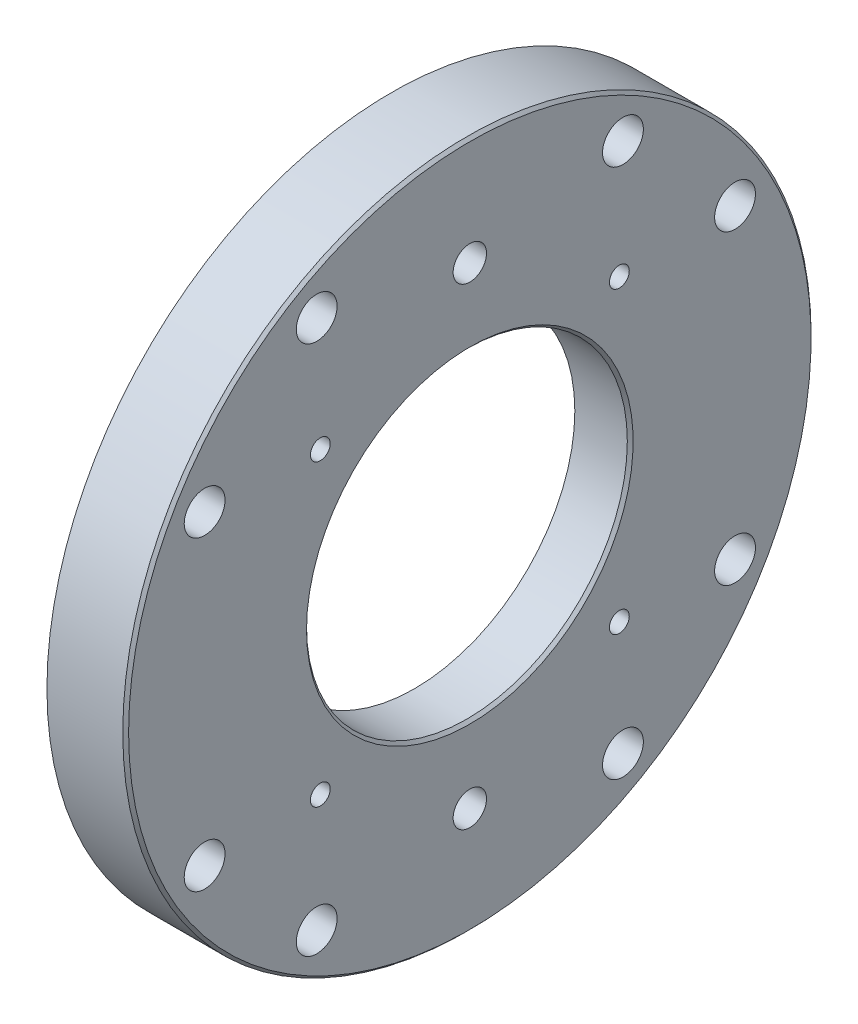
ISO-10303-21;
HEADER;
FILE_DESCRIPTION(('STEP AP214'),'2;1');
FILE_NAME('part.step','',(''),(''),'','','');
FILE_SCHEMA(('AUTOMOTIVE_DESIGN { 1 0 10303 214 1 1 1 1 }'));
ENDSEC;
DATA;
#1=APPLICATION_CONTEXT('core data for automotive mechanical design processes');
#2=APPLICATION_PROTOCOL_DEFINITION('international standard','automotive_design',2000,#1);
#3=PRODUCT_CONTEXT('',#1,'mechanical');
#4=PRODUCT('Part','Part','',(#3));
#5=PRODUCT_RELATED_PRODUCT_CATEGORY('part','',(#4));
#6=PRODUCT_DEFINITION_FORMATION('','',#4);
#7=PRODUCT_DEFINITION_CONTEXT('part definition',#1,'design');
#8=PRODUCT_DEFINITION('design','',#6,#7);
#9=PRODUCT_DEFINITION_SHAPE('','',#8);
#10=(LENGTH_UNIT() NAMED_UNIT(*) SI_UNIT(.MILLI.,.METRE.));
#11=(NAMED_UNIT(*) PLANE_ANGLE_UNIT() SI_UNIT($,.RADIAN.));
#12=(NAMED_UNIT(*) SI_UNIT($,.STERADIAN.) SOLID_ANGLE_UNIT());
#13=UNCERTAINTY_MEASURE_WITH_UNIT(LENGTH_MEASURE(1.E-05),#10,'distance_accuracy_value','');
#14=(GEOMETRIC_REPRESENTATION_CONTEXT(3) GLOBAL_UNCERTAINTY_ASSIGNED_CONTEXT((#13)) GLOBAL_UNIT_ASSIGNED_CONTEXT((#10,
#11,#12)) REPRESENTATION_CONTEXT('',''));
#15=CARTESIAN_POINT('',(0.,0.,0.));
#16=DIRECTION('',(0.,0.,1.));
#17=DIRECTION('',(1.,0.,0.));
#18=AXIS2_PLACEMENT_3D('',#15,#16,#17);
#19=CARTESIAN_POINT('',(0.,0.,0.));
#20=DIRECTION('',(-1.,0.,0.));
#21=DIRECTION('',(0.,0.,1.));
#22=AXIS2_PLACEMENT_3D('',#19,#20,#21);
#23=CONICAL_SURFACE('',#22,117.,0.785398163397442);
#24=CARTESIAN_POINT('',(-1.,0.,0.));
#25=DIRECTION('',(-1.,0.,0.));
#26=DIRECTION('',(0.,0.,1.));
#27=AXIS2_PLACEMENT_3D('',#24,#25,#26);
#28=CIRCLE('',#27,118.);
#29=CARTESIAN_POINT('',(-1.,0.,118.));
#30=VERTEX_POINT('',#29);
#31=EDGE_CURVE('E138',#30,#30,#28,.T.);
#32=ORIENTED_EDGE('',*,*,#31,.F.);
#33=EDGE_LOOP('',(#32));
#34=FACE_BOUND('',#33,.T.);
#35=CARTESIAN_POINT('',(0.,0.,0.));
#36=DIRECTION('',(-1.,0.,0.));
#37=DIRECTION('',(0.,0.,1.));
#38=AXIS2_PLACEMENT_3D('',#35,#36,#37);
#39=CIRCLE('',#38,117.);
#40=CARTESIAN_POINT('',(0.,0.,117.));
#41=VERTEX_POINT('',#40);
#42=EDGE_CURVE('E10',#41,#41,#39,.T.);
#43=ORIENTED_EDGE('',*,*,#42,.T.);
#44=EDGE_LOOP('',(#43));
#45=FACE_BOUND('',#44,.T.);
#46=ADVANCED_FACE('F37',(#34,#45),#23,.T.);
#47=CARTESIAN_POINT('',(0.,117.,0.));
#48=DIRECTION('',(-1.,0.,0.));
#49=DIRECTION('',(0.,0.,1.));
#50=AXIS2_PLACEMENT_3D('',#47,#48,#49);
#51=PLANE('',#50);
#52=CARTESIAN_POINT('',(0.,81.,0.));
#53=DIRECTION('',(-1.,0.,0.));
#54=DIRECTION('',(0.,0.,1.));
#55=AXIS2_PLACEMENT_3D('',#52,#53,#54);
#56=CIRCLE('',#55,5.7225);
#57=CARTESIAN_POINT('',(0.,81.,5.72249999999999));
#58=VERTEX_POINT('',#57);
#59=EDGE_CURVE('E90',#58,#58,#56,.T.);
#60=ORIENTED_EDGE('',*,*,#59,.T.);
#61=EDGE_LOOP('',(#60));
#62=FACE_BOUND('',#61,.T.);
#63=CARTESIAN_POINT('',(0.,-81.,0.));
#64=DIRECTION('',(-1.,0.,0.));
#65=DIRECTION('',(0.,0.,1.));
#66=AXIS2_PLACEMENT_3D('',#63,#64,#65);
#67=CIRCLE('',#66,5.7225);
#68=CARTESIAN_POINT('',(0.,-81.,5.72250000000002));
#69=VERTEX_POINT('',#68);
#70=EDGE_CURVE('E103',#69,#69,#67,.T.);
#71=ORIENTED_EDGE('',*,*,#70,.T.);
#72=EDGE_LOOP('',(#71));
#73=FACE_BOUND('',#72,.T.);
#74=CARTESIAN_POINT('',(0.,-51.2652416360247,-51.2652416360247));
#75=DIRECTION('',(-1.,0.,0.));
#76=DIRECTION('',(0.,0.,1.));
#77=AXIS2_PLACEMENT_3D('',#74,#75,#76);
#78=CIRCLE('',#77,3.4);
#79=CARTESIAN_POINT('',(0.,-51.2652416360247,-47.8652416360247));
#80=VERTEX_POINT('',#79);
#81=EDGE_CURVE('E57',#80,#80,#78,.T.);
#82=ORIENTED_EDGE('',*,*,#81,.T.);
#83=EDGE_LOOP('',(#82));
#84=FACE_BOUND('',#83,.T.);
#85=CARTESIAN_POINT('',(0.,-51.2652416360247,51.2652416360247));
#86=DIRECTION('',(-1.,0.,0.));
#87=DIRECTION('',(0.,0.,1.));
#88=AXIS2_PLACEMENT_3D('',#85,#86,#87);
#89=CIRCLE('',#88,3.4);
#90=CARTESIAN_POINT('',(0.,-51.2652416360247,54.6652416360247));
#91=VERTEX_POINT('',#90);
#92=EDGE_CURVE('E98',#91,#91,#89,.T.);
#93=ORIENTED_EDGE('',*,*,#92,.T.);
#94=EDGE_LOOP('',(#93));
#95=FACE_BOUND('',#94,.T.);
#96=CARTESIAN_POINT('',(0.,51.2652416360247,51.2652416360247));
#97=DIRECTION('',(-1.,0.,0.));
#98=DIRECTION('',(0.,0.,1.));
#99=AXIS2_PLACEMENT_3D('',#96,#97,#98);
#100=CIRCLE('',#99,3.4);
#101=CARTESIAN_POINT('',(0.,51.2652416360247,54.6652416360247));
#102=VERTEX_POINT('',#101);
#103=EDGE_CURVE('E94',#102,#102,#100,.T.);
#104=ORIENTED_EDGE('',*,*,#103,.T.);
#105=EDGE_LOOP('',(#104));
#106=FACE_BOUND('',#105,.T.);
#107=CARTESIAN_POINT('',(0.,51.2652416360247,-51.2652416360247));
#108=DIRECTION('',(-1.,0.,0.));
#109=DIRECTION('',(0.,0.,1.));
#110=AXIS2_PLACEMENT_3D('',#107,#108,#109);
#111=CIRCLE('',#110,3.4);
#112=CARTESIAN_POINT('',(0.,51.2652416360247,-47.8652416360247));
#113=VERTEX_POINT('',#112);
#114=EDGE_CURVE('E89',#113,#113,#111,.T.);
#115=ORIENTED_EDGE('',*,*,#114,.T.);
#116=EDGE_LOOP('',(#115));
#117=FACE_BOUND('',#116,.T.);
#118=CARTESIAN_POINT('',(0.,90.932667397366,-52.5));
#119=DIRECTION('',(-1.,0.,0.));
#120=DIRECTION('',(0.,0.,1.));
#121=AXIS2_PLACEMENT_3D('',#118,#119,#120);
#122=CIRCLE('',#121,7.);
#123=CARTESIAN_POINT('',(0.,90.932667397366,-45.5));
#124=VERTEX_POINT('',#123);
#125=EDGE_CURVE('E85',#124,#124,#122,.T.);
#126=ORIENTED_EDGE('',*,*,#125,.T.);
#127=EDGE_LOOP('',(#126));
#128=FACE_BOUND('',#127,.T.);
#129=CARTESIAN_POINT('',(0.,90.9326673973661,52.5));
#130=DIRECTION('',(-1.,0.,0.));
#131=DIRECTION('',(0.,0.,1.));
#132=AXIS2_PLACEMENT_3D('',#129,#130,#131);
#133=CIRCLE('',#132,7.);
#134=CARTESIAN_POINT('',(0.,90.9326673973661,59.5));
#135=VERTEX_POINT('',#134);
#136=EDGE_CURVE('E81',#135,#135,#133,.T.);
#137=ORIENTED_EDGE('',*,*,#136,.T.);
#138=EDGE_LOOP('',(#137));
#139=FACE_BOUND('',#138,.T.);
#140=CARTESIAN_POINT('',(0.,52.5,90.9326673973661));
#141=DIRECTION('',(-1.,0.,0.));
#142=DIRECTION('',(0.,0.,1.));
#143=AXIS2_PLACEMENT_3D('',#140,#141,#142);
#144=CIRCLE('',#143,7.00000000000001);
#145=CARTESIAN_POINT('',(0.,52.5,97.9326673973661));
#146=VERTEX_POINT('',#145);
#147=EDGE_CURVE('E77',#146,#146,#144,.T.);
#148=ORIENTED_EDGE('',*,*,#147,.T.);
#149=EDGE_LOOP('',(#148));
#150=FACE_BOUND('',#149,.T.);
#151=CARTESIAN_POINT('',(0.,-52.5,90.932667397366));
#152=DIRECTION('',(-1.,0.,0.));
#153=DIRECTION('',(0.,0.,1.));
#154=AXIS2_PLACEMENT_3D('',#151,#152,#153);
#155=CIRCLE('',#154,7.00000000000001);
#156=CARTESIAN_POINT('',(0.,-52.5,97.9326673973661));
#157=VERTEX_POINT('',#156);
#158=EDGE_CURVE('E73',#157,#157,#155,.T.);
#159=ORIENTED_EDGE('',*,*,#158,.T.);
#160=EDGE_LOOP('',(#159));
#161=FACE_BOUND('',#160,.T.);
#162=CARTESIAN_POINT('',(0.,-90.932667397366,52.5));
#163=DIRECTION('',(-1.,0.,0.));
#164=DIRECTION('',(0.,0.,1.));
#165=AXIS2_PLACEMENT_3D('',#162,#163,#164);
#166=CIRCLE('',#165,7.);
#167=CARTESIAN_POINT('',(0.,-90.932667397366,59.5));
#168=VERTEX_POINT('',#167);
#169=EDGE_CURVE('E69',#168,#168,#166,.T.);
#170=ORIENTED_EDGE('',*,*,#169,.T.);
#171=EDGE_LOOP('',(#170));
#172=FACE_BOUND('',#171,.T.);
#173=CARTESIAN_POINT('',(0.,-90.932667397366,-52.5));
#174=DIRECTION('',(-1.,0.,0.));
#175=DIRECTION('',(0.,0.,1.));
#176=AXIS2_PLACEMENT_3D('',#173,#174,#175);
#177=CIRCLE('',#176,7.);
#178=CARTESIAN_POINT('',(0.,-90.932667397366,-45.5));
#179=VERTEX_POINT('',#178);
#180=EDGE_CURVE('E65',#179,#179,#177,.T.);
#181=ORIENTED_EDGE('',*,*,#180,.T.);
#182=EDGE_LOOP('',(#181));
#183=FACE_BOUND('',#182,.T.);
#184=CARTESIAN_POINT('',(0.,-52.5,-90.932667397366));
#185=DIRECTION('',(-1.,0.,0.));
#186=DIRECTION('',(0.,0.,1.));
#187=AXIS2_PLACEMENT_3D('',#184,#185,#186);
#188=CIRCLE('',#187,7.00000000000001);
#189=CARTESIAN_POINT('',(0.,-52.5,-83.932667397366));
#190=VERTEX_POINT('',#189);
#191=EDGE_CURVE('E61',#190,#190,#188,.T.);
#192=ORIENTED_EDGE('',*,*,#191,.T.);
#193=EDGE_LOOP('',(#192));
#194=FACE_BOUND('',#193,.T.);
#195=CARTESIAN_POINT('',(0.,52.5,-90.9326673973661));
#196=DIRECTION('',(-1.,0.,0.));
#197=DIRECTION('',(0.,0.,1.));
#198=AXIS2_PLACEMENT_3D('',#195,#196,#197);
#199=CIRCLE('',#198,7.00000000000001);
#200=CARTESIAN_POINT('',(0.,52.5,-83.9326673973661));
#201=VERTEX_POINT('',#200);
#202=EDGE_CURVE('E56',#201,#201,#199,.T.);
#203=ORIENTED_EDGE('',*,*,#202,.T.);
#204=EDGE_LOOP('',(#203));
#205=FACE_BOUND('',#204,.T.);
#206=ORIENTED_EDGE('',*,*,#42,.F.);
#207=EDGE_LOOP('',(#206));
#208=FACE_BOUND('',#207,.T.);
#209=CARTESIAN_POINT('',(0.,0.,0.));
#210=DIRECTION('',(-1.,0.,0.));
#211=DIRECTION('',(0.,0.,1.));
#212=AXIS2_PLACEMENT_3D('',#209,#210,#211);
#213=CIRCLE('',#212,56.);
#214=CARTESIAN_POINT('',(0.,0.,56.));
#215=VERTEX_POINT('',#214);
#216=EDGE_CURVE('E44',#215,#215,#213,.T.);
#217=ORIENTED_EDGE('',*,*,#216,.T.);
#218=EDGE_LOOP('',(#217));
#219=FACE_BOUND('',#218,.T.);
#220=ADVANCED_FACE('F218',(#62,#73,#84,#95,#106,#117,#128,#139,#150,#161,#172,#183,#194,#205,
#208,#219),#51,.F.);
#221=CARTESIAN_POINT('',(-1.,0.,0.));
#222=DIRECTION('',(1.,0.,0.));
#223=DIRECTION('',(0.,0.,-1.));
#224=AXIS2_PLACEMENT_3D('',#221,#222,#223);
#225=CONICAL_SURFACE('',#224,55.,0.785398163397448);
#226=ORIENTED_EDGE('',*,*,#216,.F.);
#227=EDGE_LOOP('',(#226));
#228=FACE_BOUND('',#227,.T.);
#229=CARTESIAN_POINT('',(-1.,0.,0.));
#230=DIRECTION('',(-1.,0.,0.));
#231=DIRECTION('',(0.,0.,1.));
#232=AXIS2_PLACEMENT_3D('',#229,#230,#231);
#233=CIRCLE('',#232,55.);
#234=CARTESIAN_POINT('',(-1.,0.,55.));
#235=VERTEX_POINT('',#234);
#236=EDGE_CURVE('E49',#235,#235,#233,.T.);
#237=ORIENTED_EDGE('',*,*,#236,.T.);
#238=EDGE_LOOP('',(#237));
#239=FACE_BOUND('',#238,.T.);
#240=ADVANCED_FACE('F164',(#228,#239),#225,.F.);
#241=CARTESIAN_POINT('',(-27.,0.,0.));
#242=DIRECTION('',(-1.,0.,0.));
#243=DIRECTION('',(0.,0.,1.));
#244=AXIS2_PLACEMENT_3D('',#241,#242,#243);
#245=CYLINDRICAL_SURFACE('',#244,55.);
#246=ORIENTED_EDGE('',*,*,#236,.F.);
#247=EDGE_LOOP('',(#246));
#248=FACE_BOUND('',#247,.T.);
#249=CARTESIAN_POINT('',(-19.,0.,0.));
#250=DIRECTION('',(-1.,0.,0.));
#251=DIRECTION('',(0.,0.,1.));
#252=AXIS2_PLACEMENT_3D('',#249,#250,#251);
#253=CIRCLE('',#252,55.);
#254=CARTESIAN_POINT('',(-19.,0.,55.));
#255=VERTEX_POINT('',#254);
#256=EDGE_CURVE('E159',#255,#255,#253,.T.);
#257=ORIENTED_EDGE('',*,*,#256,.T.);
#258=EDGE_LOOP('',(#257));
#259=FACE_BOUND('',#258,.T.);
#260=ADVANCED_FACE('F166',(#248,#259),#245,.F.);
#261=CARTESIAN_POINT('',(-19.,55.,0.));
#262=DIRECTION('',(1.,0.,0.));
#263=DIRECTION('',(0.,0.,-1.));
#264=AXIS2_PLACEMENT_3D('',#261,#262,#263);
#265=PLANE('',#264);
#266=CARTESIAN_POINT('',(-19.,81.,0.));
#267=DIRECTION('',(1.,0.,0.));
#268=DIRECTION('',(0.,0.,-1.));
#269=AXIS2_PLACEMENT_3D('',#266,#267,#268);
#270=CIRCLE('',#269,5.7225);
#271=CARTESIAN_POINT('',(-19.,81.,-5.72250000000001));
#272=VERTEX_POINT('',#271);
#273=EDGE_CURVE('E40',#272,#272,#270,.T.);
#274=ORIENTED_EDGE('',*,*,#273,.T.);
#275=EDGE_LOOP('',(#274));
#276=FACE_BOUND('',#275,.T.);
#277=CARTESIAN_POINT('',(-19.,-81.,0.));
#278=DIRECTION('',(1.,0.,0.));
#279=DIRECTION('',(0.,0.,-1.));
#280=AXIS2_PLACEMENT_3D('',#277,#278,#279);
#281=CIRCLE('',#280,5.7225);
#282=CARTESIAN_POINT('',(-19.,-81.,-5.72249999999999));
#283=VERTEX_POINT('',#282);
#284=EDGE_CURVE('E101',#283,#283,#281,.T.);
#285=ORIENTED_EDGE('',*,*,#284,.T.);
#286=EDGE_LOOP('',(#285));
#287=FACE_BOUND('',#286,.T.);
#288=CARTESIAN_POINT('',(-19.,-51.2652416360247,-51.2652416360247));
#289=DIRECTION('',(1.,0.,0.));
#290=DIRECTION('',(0.,0.,-1.));
#291=AXIS2_PLACEMENT_3D('',#288,#289,#290);
#292=CIRCLE('',#291,3.4);
#293=CARTESIAN_POINT('',(-19.,-51.2652416360247,-54.6652416360247));
#294=VERTEX_POINT('',#293);
#295=EDGE_CURVE('E99',#294,#294,#292,.T.);
#296=ORIENTED_EDGE('',*,*,#295,.T.);
#297=EDGE_LOOP('',(#296));
#298=FACE_BOUND('',#297,.T.);
#299=CARTESIAN_POINT('',(-19.,-51.2652416360247,51.2652416360247));
#300=DIRECTION('',(1.,0.,0.));
#301=DIRECTION('',(0.,0.,-1.));
#302=AXIS2_PLACEMENT_3D('',#299,#300,#301);
#303=CIRCLE('',#302,3.4);
#304=CARTESIAN_POINT('',(-19.,-51.2652416360247,47.8652416360247));
#305=VERTEX_POINT('',#304);
#306=EDGE_CURVE('E95',#305,#305,#303,.T.);
#307=ORIENTED_EDGE('',*,*,#306,.T.);
#308=EDGE_LOOP('',(#307));
#309=FACE_BOUND('',#308,.T.);
#310=CARTESIAN_POINT('',(-19.,51.2652416360247,51.2652416360247));
#311=DIRECTION('',(1.,0.,0.));
#312=DIRECTION('',(0.,0.,-1.));
#313=AXIS2_PLACEMENT_3D('',#310,#311,#312);
#314=CIRCLE('',#313,3.4);
#315=CARTESIAN_POINT('',(-19.,51.2652416360247,47.8652416360247));
#316=VERTEX_POINT('',#315);
#317=EDGE_CURVE('E91',#316,#316,#314,.T.);
#318=ORIENTED_EDGE('',*,*,#317,.T.);
#319=EDGE_LOOP('',(#318));
#320=FACE_BOUND('',#319,.T.);
#321=CARTESIAN_POINT('',(-19.,51.2652416360247,-51.2652416360247));
#322=DIRECTION('',(1.,0.,0.));
#323=DIRECTION('',(0.,0.,-1.));
#324=AXIS2_PLACEMENT_3D('',#321,#322,#323);
#325=CIRCLE('',#324,3.4);
#326=CARTESIAN_POINT('',(-19.,51.2652416360247,-54.6652416360247));
#327=VERTEX_POINT('',#326);
#328=EDGE_CURVE('E86',#327,#327,#325,.T.);
#329=ORIENTED_EDGE('',*,*,#328,.T.);
#330=EDGE_LOOP('',(#329));
#331=FACE_BOUND('',#330,.T.);
#332=ORIENTED_EDGE('',*,*,#256,.F.);
#333=EDGE_LOOP('',(#332));
#334=FACE_BOUND('',#333,.T.);
#335=CARTESIAN_POINT('',(-19.,0.,0.));
#336=DIRECTION('',(-1.,0.,0.));
#337=DIRECTION('',(0.,0.,1.));
#338=AXIS2_PLACEMENT_3D('',#335,#336,#337);
#339=CIRCLE('',#338,88.);
#340=CARTESIAN_POINT('',(-19.,0.,88.));
#341=VERTEX_POINT('',#340);
#342=EDGE_CURVE('E156',#341,#341,#339,.T.);
#343=ORIENTED_EDGE('',*,*,#342,.T.);
#344=EDGE_LOOP('',(#343));
#345=FACE_BOUND('',#344,.T.);
#346=ADVANCED_FACE('F169',(#276,#287,#298,#309,#320,#331,#334,#345),#265,.F.);
#347=CARTESIAN_POINT('',(-27.,0.,0.));
#348=DIRECTION('',(-1.,0.,0.));
#349=DIRECTION('',(0.,0.,1.));
#350=AXIS2_PLACEMENT_3D('',#347,#348,#349);
#351=CYLINDRICAL_SURFACE('',#350,88.);
#352=ORIENTED_EDGE('',*,*,#342,.F.);
#353=EDGE_LOOP('',(#352));
#354=FACE_BOUND('',#353,.T.);
#355=CARTESIAN_POINT('',(-24.,0.,0.));
#356=DIRECTION('',(-1.,0.,0.));
#357=DIRECTION('',(0.,0.,1.));
#358=AXIS2_PLACEMENT_3D('',#355,#356,#357);
#359=CIRCLE('',#358,88.);
#360=CARTESIAN_POINT('',(-24.,0.,88.));
#361=VERTEX_POINT('',#360);
#362=EDGE_CURVE('E153',#361,#361,#359,.T.);
#363=ORIENTED_EDGE('',*,*,#362,.T.);
#364=EDGE_LOOP('',(#363));
#365=FACE_BOUND('',#364,.T.);
#366=ADVANCED_FACE('F175',(#354,#365),#351,.F.);
#367=CARTESIAN_POINT('',(-24.,88.,0.));
#368=DIRECTION('',(1.,0.,0.));
#369=DIRECTION('',(0.,0.,-1.));
#370=AXIS2_PLACEMENT_3D('',#367,#368,#369);
#371=PLANE('',#370);
#372=CARTESIAN_POINT('',(-24.,90.932667397366,-52.5));
#373=DIRECTION('',(1.,0.,0.));
#374=DIRECTION('',(0.,0.,-1.));
#375=AXIS2_PLACEMENT_3D('',#372,#373,#374);
#376=CIRCLE('',#375,7.);
#377=CARTESIAN_POINT('',(-24.,90.932667397366,-59.5));
#378=VERTEX_POINT('',#377);
#379=EDGE_CURVE('E82',#378,#378,#376,.T.);
#380=ORIENTED_EDGE('',*,*,#379,.T.);
#381=EDGE_LOOP('',(#380));
#382=FACE_BOUND('',#381,.T.);
#383=CARTESIAN_POINT('',(-24.,90.9326673973661,52.5));
#384=DIRECTION('',(1.,0.,0.));
#385=DIRECTION('',(0.,0.,-1.));
#386=AXIS2_PLACEMENT_3D('',#383,#384,#385);
#387=CIRCLE('',#386,7.);
#388=CARTESIAN_POINT('',(-24.,90.9326673973661,45.5));
#389=VERTEX_POINT('',#388);
#390=EDGE_CURVE('E78',#389,#389,#387,.T.);
#391=ORIENTED_EDGE('',*,*,#390,.T.);
#392=EDGE_LOOP('',(#391));
#393=FACE_BOUND('',#392,.T.);
#394=CARTESIAN_POINT('',(-24.,52.5,90.9326673973661));
#395=DIRECTION('',(1.,0.,0.));
#396=DIRECTION('',(0.,0.,-1.));
#397=AXIS2_PLACEMENT_3D('',#394,#395,#396);
#398=CIRCLE('',#397,7.00000000000001);
#399=CARTESIAN_POINT('',(-24.,52.5,83.9326673973661));
#400=VERTEX_POINT('',#399);
#401=EDGE_CURVE('E74',#400,#400,#398,.T.);
#402=ORIENTED_EDGE('',*,*,#401,.T.);
#403=EDGE_LOOP('',(#402));
#404=FACE_BOUND('',#403,.T.);
#405=CARTESIAN_POINT('',(-24.,-52.5,90.932667397366));
#406=DIRECTION('',(1.,0.,0.));
#407=DIRECTION('',(0.,0.,-1.));
#408=AXIS2_PLACEMENT_3D('',#405,#406,#407);
#409=CIRCLE('',#408,7.00000000000001);
#410=CARTESIAN_POINT('',(-24.,-52.5,83.932667397366));
#411=VERTEX_POINT('',#410);
#412=EDGE_CURVE('E70',#411,#411,#409,.T.);
#413=ORIENTED_EDGE('',*,*,#412,.T.);
#414=EDGE_LOOP('',(#413));
#415=FACE_BOUND('',#414,.T.);
#416=CARTESIAN_POINT('',(-24.,-90.932667397366,52.5));
#417=DIRECTION('',(1.,0.,0.));
#418=DIRECTION('',(0.,0.,-1.));
#419=AXIS2_PLACEMENT_3D('',#416,#417,#418);
#420=CIRCLE('',#419,7.);
#421=CARTESIAN_POINT('',(-24.,-90.932667397366,45.5));
#422=VERTEX_POINT('',#421);
#423=EDGE_CURVE('E66',#422,#422,#420,.T.);
#424=ORIENTED_EDGE('',*,*,#423,.T.);
#425=EDGE_LOOP('',(#424));
#426=FACE_BOUND('',#425,.T.);
#427=CARTESIAN_POINT('',(-24.,-90.932667397366,-52.5));
#428=DIRECTION('',(1.,0.,0.));
#429=DIRECTION('',(0.,0.,-1.));
#430=AXIS2_PLACEMENT_3D('',#427,#428,#429);
#431=CIRCLE('',#430,7.);
#432=CARTESIAN_POINT('',(-24.,-90.932667397366,-59.5));
#433=VERTEX_POINT('',#432);
#434=EDGE_CURVE('E62',#433,#433,#431,.T.);
#435=ORIENTED_EDGE('',*,*,#434,.T.);
#436=EDGE_LOOP('',(#435));
#437=FACE_BOUND('',#436,.T.);
#438=CARTESIAN_POINT('',(-24.,-52.5,-90.932667397366));
#439=DIRECTION('',(1.,0.,0.));
#440=DIRECTION('',(0.,0.,-1.));
#441=AXIS2_PLACEMENT_3D('',#438,#439,#440);
#442=CIRCLE('',#441,7.00000000000001);
#443=CARTESIAN_POINT('',(-24.,-52.5,-97.932667397366));
#444=VERTEX_POINT('',#443);
#445=EDGE_CURVE('E58',#444,#444,#442,.T.);
#446=ORIENTED_EDGE('',*,*,#445,.T.);
#447=EDGE_LOOP('',(#446));
#448=FACE_BOUND('',#447,.T.);
#449=CARTESIAN_POINT('',(-24.,52.5,-90.9326673973661));
#450=DIRECTION('',(1.,0.,0.));
#451=DIRECTION('',(0.,0.,-1.));
#452=AXIS2_PLACEMENT_3D('',#449,#450,#451);
#453=CIRCLE('',#452,7.00000000000001);
#454=CARTESIAN_POINT('',(-24.,52.5,-97.9326673973661));
#455=VERTEX_POINT('',#454);
#456=EDGE_CURVE('E53',#455,#455,#453,.T.);
#457=ORIENTED_EDGE('',*,*,#456,.T.);
#458=EDGE_LOOP('',(#457));
#459=FACE_BOUND('',#458,.T.);
#460=ORIENTED_EDGE('',*,*,#362,.F.);
#461=EDGE_LOOP('',(#460));
#462=FACE_BOUND('',#461,.T.);
#463=CARTESIAN_POINT('',(-24.,0.,0.));
#464=DIRECTION('',(-1.,0.,0.));
#465=DIRECTION('',(0.,0.,1.));
#466=AXIS2_PLACEMENT_3D('',#463,#464,#465);
#467=CIRCLE('',#466,115.);
#468=CARTESIAN_POINT('',(-24.,0.,115.));
#469=VERTEX_POINT('',#468);
#470=EDGE_CURVE('E150',#469,#469,#467,.T.);
#471=ORIENTED_EDGE('',*,*,#470,.T.);
#472=EDGE_LOOP('',(#471));
#473=FACE_BOUND('',#472,.T.);
#474=ADVANCED_FACE('F182',(#382,#393,#404,#415,#426,#437,#448,#459,#462,#473),#371,.F.);
#475=CARTESIAN_POINT('',(-27.,0.,0.));
#476=DIRECTION('',(-1.,0.,0.));
#477=DIRECTION('',(0.,0.,1.));
#478=AXIS2_PLACEMENT_3D('',#475,#476,#477);
#479=CYLINDRICAL_SURFACE('',#478,115.);
#480=ORIENTED_EDGE('',*,*,#470,.F.);
#481=EDGE_LOOP('',(#480));
#482=FACE_BOUND('',#481,.T.);
#483=CARTESIAN_POINT('',(-26.5,0.,0.));
#484=DIRECTION('',(-1.,0.,0.));
#485=DIRECTION('',(0.,0.,1.));
#486=AXIS2_PLACEMENT_3D('',#483,#484,#485);
#487=CIRCLE('',#486,115.);
#488=CARTESIAN_POINT('',(-26.5,0.,115.));
#489=VERTEX_POINT('',#488);
#490=EDGE_CURVE('E147',#489,#489,#487,.T.);
#491=ORIENTED_EDGE('',*,*,#490,.T.);
#492=EDGE_LOOP('',(#491));
#493=FACE_BOUND('',#492,.T.);
#494=ADVANCED_FACE('F188',(#482,#493),#479,.F.);
#495=CARTESIAN_POINT('',(-27.,0.,0.));
#496=DIRECTION('',(-1.,0.,0.));
#497=DIRECTION('',(0.,0.,1.));
#498=AXIS2_PLACEMENT_3D('',#495,#496,#497);
#499=CONICAL_SURFACE('',#498,115.5,0.785398163397448);
#500=ORIENTED_EDGE('',*,*,#490,.F.);
#501=EDGE_LOOP('',(#500));
#502=FACE_BOUND('',#501,.T.);
#503=CARTESIAN_POINT('',(-27.,0.,0.));
#504=DIRECTION('',(-1.,0.,0.));
#505=DIRECTION('',(0.,0.,1.));
#506=AXIS2_PLACEMENT_3D('',#503,#504,#505);
#507=CIRCLE('',#506,115.5);
#508=CARTESIAN_POINT('',(-27.,0.,115.5));
#509=VERTEX_POINT('',#508);
#510=EDGE_CURVE('E144',#509,#509,#507,.T.);
#511=ORIENTED_EDGE('',*,*,#510,.T.);
#512=EDGE_LOOP('',(#511));
#513=FACE_BOUND('',#512,.T.);
#514=ADVANCED_FACE('F195',(#502,#513),#499,.F.);
#515=CARTESIAN_POINT('',(-27.,115.5,0.));
#516=DIRECTION('',(1.,0.,0.));
#517=DIRECTION('',(0.,0.,-1.));
#518=AXIS2_PLACEMENT_3D('',#515,#516,#517);
#519=PLANE('',#518);
#520=ORIENTED_EDGE('',*,*,#510,.F.);
#521=EDGE_LOOP('',(#520));
#522=FACE_BOUND('',#521,.T.);
#523=CARTESIAN_POINT('',(-27.,0.,0.));
#524=DIRECTION('',(-1.,0.,0.));
#525=DIRECTION('',(0.,0.,1.));
#526=AXIS2_PLACEMENT_3D('',#523,#524,#525);
#527=CIRCLE('',#526,118.);
#528=CARTESIAN_POINT('',(-27.,0.,118.));
#529=VERTEX_POINT('',#528);
#530=EDGE_CURVE('E141',#529,#529,#527,.T.);
#531=ORIENTED_EDGE('',*,*,#530,.T.);
#532=EDGE_LOOP('',(#531));
#533=FACE_BOUND('',#532,.T.);
#534=ADVANCED_FACE('F201',(#522,#533),#519,.F.);
#535=CARTESIAN_POINT('',(-27.,0.,0.));
#536=DIRECTION('',(-1.,0.,0.));
#537=DIRECTION('',(0.,0.,1.));
#538=AXIS2_PLACEMENT_3D('',#535,#536,#537);
#539=CYLINDRICAL_SURFACE('',#538,118.);
#540=ORIENTED_EDGE('',*,*,#530,.F.);
#541=EDGE_LOOP('',(#540));
#542=FACE_BOUND('',#541,.T.);
#543=ORIENTED_EDGE('',*,*,#31,.T.);
#544=EDGE_LOOP('',(#543));
#545=FACE_BOUND('',#544,.T.);
#546=ADVANCED_FACE('F207',(#542,#545),#539,.T.);
#547=CARTESIAN_POINT('',(-27.,52.5,-90.9326673973661));
#548=DIRECTION('',(1.,0.,0.));
#549=DIRECTION('',(0.,0.,-1.));
#550=AXIS2_PLACEMENT_3D('',#547,#548,#549);
#551=CYLINDRICAL_SURFACE('',#550,7.00000000000001);
#552=ORIENTED_EDGE('',*,*,#456,.F.);
#553=EDGE_LOOP('',(#552));
#554=FACE_BOUND('',#553,.T.);
#555=ORIENTED_EDGE('',*,*,#202,.F.);
#556=EDGE_LOOP('',(#555));
#557=FACE_BOUND('',#556,.T.);
#558=ADVANCED_FACE('F213',(#554,#557),#551,.F.);
#559=CARTESIAN_POINT('',(-27.,-52.5,-90.932667397366));
#560=DIRECTION('',(1.,0.,0.));
#561=DIRECTION('',(0.,0.,-1.));
#562=AXIS2_PLACEMENT_3D('',#559,#560,#561);
#563=CYLINDRICAL_SURFACE('',#562,7.00000000000001);
#564=ORIENTED_EDGE('',*,*,#445,.F.);
#565=EDGE_LOOP('',(#564));
#566=FACE_BOUND('',#565,.T.);
#567=ORIENTED_EDGE('',*,*,#191,.F.);
#568=EDGE_LOOP('',(#567));
#569=FACE_BOUND('',#568,.T.);
#570=ADVANCED_FACE('F231',(#566,#569),#563,.F.);
#571=CARTESIAN_POINT('',(-27.,-90.932667397366,-52.5));
#572=DIRECTION('',(1.,0.,0.));
#573=DIRECTION('',(0.,0.,-1.));
#574=AXIS2_PLACEMENT_3D('',#571,#572,#573);
#575=CYLINDRICAL_SURFACE('',#574,7.);
#576=ORIENTED_EDGE('',*,*,#434,.F.);
#577=EDGE_LOOP('',(#576));
#578=FACE_BOUND('',#577,.T.);
#579=ORIENTED_EDGE('',*,*,#180,.F.);
#580=EDGE_LOOP('',(#579));
#581=FACE_BOUND('',#580,.T.);
#582=ADVANCED_FACE('F253',(#578,#581),#575,.F.);
#583=CARTESIAN_POINT('',(-27.,-90.932667397366,52.5));
#584=DIRECTION('',(1.,0.,0.));
#585=DIRECTION('',(0.,0.,-1.));
#586=AXIS2_PLACEMENT_3D('',#583,#584,#585);
#587=CYLINDRICAL_SURFACE('',#586,7.);
#588=ORIENTED_EDGE('',*,*,#423,.F.);
#589=EDGE_LOOP('',(#588));
#590=FACE_BOUND('',#589,.T.);
#591=ORIENTED_EDGE('',*,*,#169,.F.);
#592=EDGE_LOOP('',(#591));
#593=FACE_BOUND('',#592,.T.);
#594=ADVANCED_FACE('F237',(#590,#593),#587,.F.);
#595=CARTESIAN_POINT('',(-27.,-52.5,90.932667397366));
#596=DIRECTION('',(1.,0.,0.));
#597=DIRECTION('',(0.,0.,-1.));
#598=AXIS2_PLACEMENT_3D('',#595,#596,#597);
#599=CYLINDRICAL_SURFACE('',#598,7.00000000000001);
#600=ORIENTED_EDGE('',*,*,#412,.F.);
#601=EDGE_LOOP('',(#600));
#602=FACE_BOUND('',#601,.T.);
#603=ORIENTED_EDGE('',*,*,#158,.F.);
#604=EDGE_LOOP('',(#603));
#605=FACE_BOUND('',#604,.T.);
#606=ADVANCED_FACE('F233',(#602,#605),#599,.F.);
#607=CARTESIAN_POINT('',(-27.,52.5,90.9326673973661));
#608=DIRECTION('',(1.,0.,0.));
#609=DIRECTION('',(0.,0.,-1.));
#610=AXIS2_PLACEMENT_3D('',#607,#608,#609);
#611=CYLINDRICAL_SURFACE('',#610,7.00000000000001);
#612=ORIENTED_EDGE('',*,*,#401,.F.);
#613=EDGE_LOOP('',(#612));
#614=FACE_BOUND('',#613,.T.);
#615=ORIENTED_EDGE('',*,*,#147,.F.);
#616=EDGE_LOOP('',(#615));
#617=FACE_BOUND('',#616,.T.);
#618=ADVANCED_FACE('F236',(#614,#617),#611,.F.);
#619=CARTESIAN_POINT('',(-27.,90.9326673973661,52.5));
#620=DIRECTION('',(1.,0.,0.));
#621=DIRECTION('',(0.,0.,-1.));
#622=AXIS2_PLACEMENT_3D('',#619,#620,#621);
#623=CYLINDRICAL_SURFACE('',#622,7.);
#624=ORIENTED_EDGE('',*,*,#390,.F.);
#625=EDGE_LOOP('',(#624));
#626=FACE_BOUND('',#625,.T.);
#627=ORIENTED_EDGE('',*,*,#136,.F.);
#628=EDGE_LOOP('',(#627));
#629=FACE_BOUND('',#628,.T.);
#630=ADVANCED_FACE('F241',(#626,#629),#623,.F.);
#631=CARTESIAN_POINT('',(-27.,90.932667397366,-52.5));
#632=DIRECTION('',(1.,0.,0.));
#633=DIRECTION('',(0.,0.,-1.));
#634=AXIS2_PLACEMENT_3D('',#631,#632,#633);
#635=CYLINDRICAL_SURFACE('',#634,7.);
#636=ORIENTED_EDGE('',*,*,#379,.F.);
#637=EDGE_LOOP('',(#636));
#638=FACE_BOUND('',#637,.T.);
#639=ORIENTED_EDGE('',*,*,#125,.F.);
#640=EDGE_LOOP('',(#639));
#641=FACE_BOUND('',#640,.T.);
#642=ADVANCED_FACE('F245',(#638,#641),#635,.F.);
#643=CARTESIAN_POINT('',(-27.,51.2652416360247,-51.2652416360247));
#644=DIRECTION('',(1.,0.,0.));
#645=DIRECTION('',(0.,0.,-1.));
#646=AXIS2_PLACEMENT_3D('',#643,#644,#645);
#647=CYLINDRICAL_SURFACE('',#646,3.4);
#648=ORIENTED_EDGE('',*,*,#328,.F.);
#649=EDGE_LOOP('',(#648));
#650=FACE_BOUND('',#649,.T.);
#651=ORIENTED_EDGE('',*,*,#114,.F.);
#652=EDGE_LOOP('',(#651));
#653=FACE_BOUND('',#652,.T.);
#654=ADVANCED_FACE('F249',(#650,#653),#647,.F.);
#655=CARTESIAN_POINT('',(-27.,51.2652416360247,51.2652416360247));
#656=DIRECTION('',(1.,0.,0.));
#657=DIRECTION('',(0.,0.,-1.));
#658=AXIS2_PLACEMENT_3D('',#655,#656,#657);
#659=CYLINDRICAL_SURFACE('',#658,3.4);
#660=ORIENTED_EDGE('',*,*,#317,.F.);
#661=EDGE_LOOP('',(#660));
#662=FACE_BOUND('',#661,.T.);
#663=ORIENTED_EDGE('',*,*,#103,.F.);
#664=EDGE_LOOP('',(#663));
#665=FACE_BOUND('',#664,.T.);
#666=ADVANCED_FACE('F263',(#662,#665),#659,.F.);
#667=CARTESIAN_POINT('',(-27.,-51.2652416360247,51.2652416360247));
#668=DIRECTION('',(1.,0.,0.));
#669=DIRECTION('',(0.,0.,-1.));
#670=AXIS2_PLACEMENT_3D('',#667,#668,#669);
#671=CYLINDRICAL_SURFACE('',#670,3.4);
#672=ORIENTED_EDGE('',*,*,#306,.F.);
#673=EDGE_LOOP('',(#672));
#674=FACE_BOUND('',#673,.T.);
#675=ORIENTED_EDGE('',*,*,#92,.F.);
#676=EDGE_LOOP('',(#675));
#677=FACE_BOUND('',#676,.T.);
#678=ADVANCED_FACE('F269',(#674,#677),#671,.F.);
#679=CARTESIAN_POINT('',(-27.,-51.2652416360247,-51.2652416360247));
#680=DIRECTION('',(1.,0.,0.));
#681=DIRECTION('',(0.,0.,-1.));
#682=AXIS2_PLACEMENT_3D('',#679,#680,#681);
#683=CYLINDRICAL_SURFACE('',#682,3.4);
#684=ORIENTED_EDGE('',*,*,#295,.F.);
#685=EDGE_LOOP('',(#684));
#686=FACE_BOUND('',#685,.T.);
#687=ORIENTED_EDGE('',*,*,#81,.F.);
#688=EDGE_LOOP('',(#687));
#689=FACE_BOUND('',#688,.T.);
#690=ADVANCED_FACE('F265',(#686,#689),#683,.F.);
#691=CARTESIAN_POINT('',(-27.,-81.,0.));
#692=DIRECTION('',(1.,0.,0.));
#693=DIRECTION('',(0.,0.,-1.));
#694=AXIS2_PLACEMENT_3D('',#691,#692,#693);
#695=CYLINDRICAL_SURFACE('',#694,5.7225);
#696=ORIENTED_EDGE('',*,*,#284,.F.);
#697=EDGE_LOOP('',(#696));
#698=FACE_BOUND('',#697,.T.);
#699=ORIENTED_EDGE('',*,*,#70,.F.);
#700=EDGE_LOOP('',(#699));
#701=FACE_BOUND('',#700,.T.);
#702=ADVANCED_FACE('F268',(#698,#701),#695,.F.);
#703=CARTESIAN_POINT('',(-27.,81.,0.));
#704=DIRECTION('',(1.,0.,0.));
#705=DIRECTION('',(0.,0.,-1.));
#706=AXIS2_PLACEMENT_3D('',#703,#704,#705);
#707=CYLINDRICAL_SURFACE('',#706,5.7225);
#708=ORIENTED_EDGE('',*,*,#273,.F.);
#709=EDGE_LOOP('',(#708));
#710=FACE_BOUND('',#709,.T.);
#711=ORIENTED_EDGE('',*,*,#59,.F.);
#712=EDGE_LOOP('',(#711));
#713=FACE_BOUND('',#712,.T.);
#714=ADVANCED_FACE('F279',(#710,#713),#707,.F.);
#715=CLOSED_SHELL('',(#46,#220,#240,#260,#346,#366,#474,#494,#514,#534,#546,#558,#570,#582,#594,
#606,#618,#630,#642,#654,#666,#678,#690,#702,#714));
#716=MANIFOLD_SOLID_BREP('B2',#715);
#717=ADVANCED_BREP_SHAPE_REPRESENTATION('',(#18,#716),#14);
#718=SHAPE_DEFINITION_REPRESENTATION(#9,#717);
ENDSEC;
END-ISO-10303-21;
